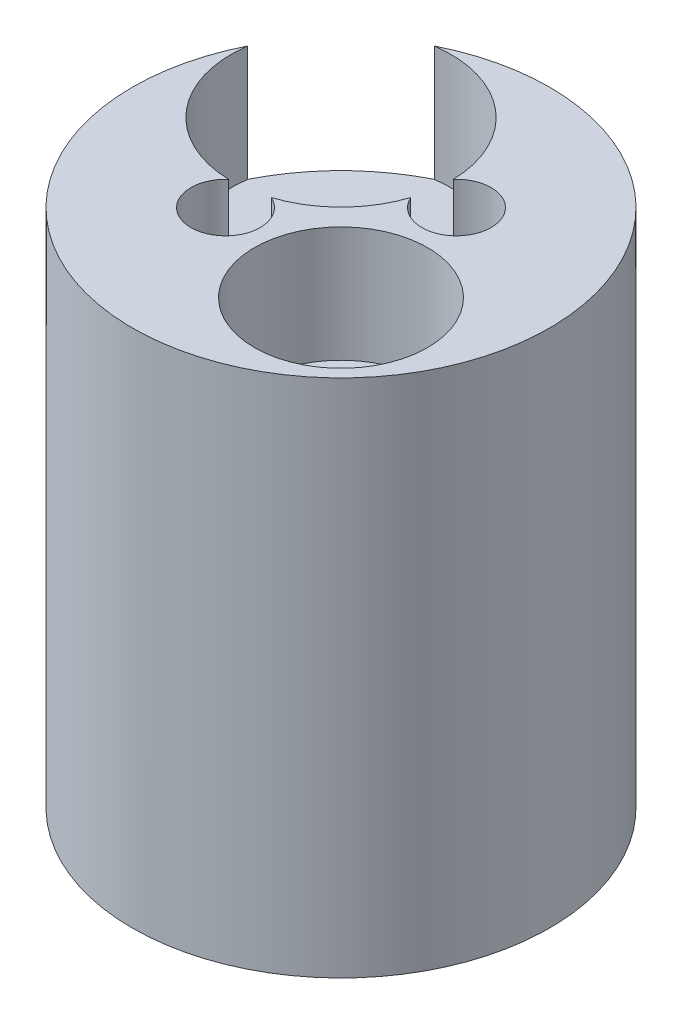
ISO-10303-21;
HEADER;
FILE_DESCRIPTION(('STEP AP214'),'2;1');
FILE_NAME('part.step','',(''),(''),'','','');
FILE_SCHEMA(('AUTOMOTIVE_DESIGN { 1 0 10303 214 1 1 1 1 }'));
ENDSEC;
DATA;
#1=APPLICATION_CONTEXT('core data for automotive mechanical design processes');
#2=APPLICATION_PROTOCOL_DEFINITION('international standard','automotive_design',2000,#1);
#3=PRODUCT_CONTEXT('',#1,'mechanical');
#4=PRODUCT('Part','Part','',(#3));
#5=PRODUCT_RELATED_PRODUCT_CATEGORY('part','',(#4));
#6=PRODUCT_DEFINITION_FORMATION('','',#4);
#7=PRODUCT_DEFINITION_CONTEXT('part definition',#1,'design');
#8=PRODUCT_DEFINITION('design','',#6,#7);
#9=PRODUCT_DEFINITION_SHAPE('','',#8);
#10=(LENGTH_UNIT() NAMED_UNIT(*) SI_UNIT(.MILLI.,.METRE.));
#11=(NAMED_UNIT(*) PLANE_ANGLE_UNIT() SI_UNIT($,.RADIAN.));
#12=(NAMED_UNIT(*) SI_UNIT($,.STERADIAN.) SOLID_ANGLE_UNIT());
#13=UNCERTAINTY_MEASURE_WITH_UNIT(LENGTH_MEASURE(1.E-05),#10,'distance_accuracy_value','');
#14=(GEOMETRIC_REPRESENTATION_CONTEXT(3) GLOBAL_UNCERTAINTY_ASSIGNED_CONTEXT((#13)) GLOBAL_UNIT_ASSIGNED_CONTEXT((#10,
#11,#12)) REPRESENTATION_CONTEXT('',''));
#15=CARTESIAN_POINT('',(0.,0.,0.));
#16=DIRECTION('',(0.,0.,1.));
#17=DIRECTION('',(1.,0.,0.));
#18=AXIS2_PLACEMENT_3D('',#15,#16,#17);
#19=CARTESIAN_POINT('',(-34.29,177.8,-34.29));
#20=DIRECTION('',(0.,1.,0.));
#21=DIRECTION('',(0.,0.,1.));
#22=AXIS2_PLACEMENT_3D('',#19,#20,#21);
#23=CYLINDRICAL_SURFACE('',#22,48.26);
#24=CARTESIAN_POINT('',(-34.29,177.8,-34.29));
#25=DIRECTION('',(0.,1.,0.));
#26=DIRECTION('',(0.,0.,1.));
#27=AXIS2_PLACEMENT_3D('',#24,#25,#26);
#28=CIRCLE('',#27,48.26);
#29=CARTESIAN_POINT('',(-19.1076610438493,177.8,11.5196516448286));
#30=VERTEX_POINT('',#29);
#31=CARTESIAN_POINT('',(11.5196516448286,177.8,-19.1076610438493));
#32=VERTEX_POINT('',#31);
#33=EDGE_CURVE('E57',#30,#32,#28,.T.);
#34=ORIENTED_EDGE('',*,*,#33,.F.);
#35=DIRECTION('',(0.,1.,0.));
#36=VECTOR('',#35,1.);
#37=CARTESIAN_POINT('',(-19.1076610438493,139.7,11.5196516448286));
#38=LINE('',#37,#36);
#39=CARTESIAN_POINT('',(-19.1076610438493,228.6,11.5196516448286));
#40=VERTEX_POINT('',#39);
#41=EDGE_CURVE('E11',#30,#40,#38,.T.);
#42=ORIENTED_EDGE('',*,*,#41,.T.);
#43=CARTESIAN_POINT('',(-34.29,228.6,-34.29));
#44=DIRECTION('',(0.,1.,0.));
#45=DIRECTION('',(0.,0.,1.));
#46=AXIS2_PLACEMENT_3D('',#43,#44,#45);
#47=CIRCLE('',#46,48.26);
#48=CARTESIAN_POINT('',(11.5196516448286,228.6,-19.1076610438493));
#49=VERTEX_POINT('',#48);
#50=EDGE_CURVE('E97',#40,#49,#47,.T.);
#51=ORIENTED_EDGE('',*,*,#50,.T.);
#52=DIRECTION('',(0.,1.,0.));
#53=VECTOR('',#52,1.);
#54=CARTESIAN_POINT('',(11.5196516448286,139.7,-19.1076610438493));
#55=LINE('',#54,#53);
#56=EDGE_CURVE('E114',#49,#32,#55,.F.);
#57=ORIENTED_EDGE('',*,*,#56,.T.);
#58=EDGE_LOOP('',(#34,#42,#51,#57));
#59=FACE_BOUND('',#58,.T.);
#60=ADVANCED_FACE('F35',(#59),#23,.F.);
#61=CARTESIAN_POINT('',(13.9557159371023,177.8,-35.4640927205439));
#62=VERTEX_POINT('',#61);
#63=CARTESIAN_POINT('',(-41.0187883238819,177.8,-82.0786075094513));
#64=VERTEX_POINT('',#63);
#65=EDGE_CURVE('E128',#62,#64,#28,.T.);
#66=ORIENTED_EDGE('',*,*,#65,.F.);
#67=DIRECTION('',(0.,1.,0.));
#68=VECTOR('',#67,1.);
#69=CARTESIAN_POINT('',(13.9557159371023,139.7,-35.4640927205439));
#70=LINE('',#69,#68);
#71=CARTESIAN_POINT('',(13.9557159371023,228.6,-35.4640927205439));
#72=VERTEX_POINT('',#71);
#73=EDGE_CURVE('E116',#62,#72,#70,.T.);
#74=ORIENTED_EDGE('',*,*,#73,.T.);
#75=CARTESIAN_POINT('',(-41.0187883238819,228.6,-82.0786075094514));
#76=VERTEX_POINT('',#75);
#77=EDGE_CURVE('E105',#72,#76,#47,.T.);
#78=ORIENTED_EDGE('',*,*,#77,.T.);
#79=DIRECTION('',(0.,1.,0.));
#80=VECTOR('',#79,1.);
#81=CARTESIAN_POINT('',(-41.0187883238819,203.2,-82.0786075094514));
#82=LINE('',#81,#80);
#83=EDGE_CURVE('E129',#64,#76,#82,.T.);
#84=ORIENTED_EDGE('',*,*,#83,.F.);
#85=EDGE_LOOP('',(#66,#74,#78,#84));
#86=FACE_BOUND('',#85,.T.);
#87=ADVANCED_FACE('F203',(#86),#23,.F.);
#88=CARTESIAN_POINT('',(0.,228.6,0.));
#89=DIRECTION('',(0.,-1.,0.));
#90=DIRECTION('',(0.,0.,-1.));
#91=AXIS2_PLACEMENT_3D('',#88,#89,#90);
#92=CYLINDRICAL_SURFACE('',#91,91.7575);
#93=CARTESIAN_POINT('',(0.,177.8,0.));
#94=DIRECTION('',(0.,1.,0.));
#95=DIRECTION('',(0.,0.,1.));
#96=AXIS2_PLACEMENT_3D('',#93,#94,#95);
#97=CIRCLE('',#96,91.7575);
#98=CARTESIAN_POINT('',(-82.0786075094513,177.8,-41.0187883238819));
#99=VERTEX_POINT('',#98);
#100=EDGE_CURVE('E107',#64,#99,#97,.T.);
#101=ORIENTED_EDGE('',*,*,#100,.F.);
#102=ORIENTED_EDGE('',*,*,#83,.T.);
#103=CARTESIAN_POINT('',(0.,228.6,0.));
#104=DIRECTION('',(0.,1.,0.));
#105=DIRECTION('',(0.,0.,1.));
#106=AXIS2_PLACEMENT_3D('',#103,#104,#105);
#107=CIRCLE('',#106,91.7575);
#108=CARTESIAN_POINT('',(-82.0786075094513,228.6,-41.0187883238819));
#109=VERTEX_POINT('',#108);
#110=EDGE_CURVE('E108',#109,#76,#107,.T.);
#111=ORIENTED_EDGE('',*,*,#110,.F.);
#112=DIRECTION('',(0.,1.,0.));
#113=VECTOR('',#112,1.);
#114=CARTESIAN_POINT('',(-82.0786075094513,203.2,-41.0187883238819));
#115=LINE('',#114,#113);
#116=EDGE_CURVE('E126',#109,#99,#115,.F.);
#117=ORIENTED_EDGE('',*,*,#116,.T.);
#118=EDGE_LOOP('',(#101,#102,#111,#117));
#119=FACE_BOUND('',#118,.T.);
#120=CARTESIAN_POINT('',(0.,0.,0.));
#121=DIRECTION('',(0.,1.,0.));
#122=DIRECTION('',(0.,0.,1.));
#123=AXIS2_PLACEMENT_3D('',#120,#121,#122);
#124=CIRCLE('',#123,91.7575);
#125=CARTESIAN_POINT('',(0.,0.,91.7575));
#126=VERTEX_POINT('',#125);
#127=EDGE_CURVE('E111',#126,#126,#124,.T.);
#128=ORIENTED_EDGE('',*,*,#127,.T.);
#129=EDGE_LOOP('',(#128));
#130=FACE_BOUND('',#129,.T.);
#131=ADVANCED_FACE('F37',(#119,#130),#92,.T.);
#132=CARTESIAN_POINT('',(0.,228.6,0.));
#133=DIRECTION('',(0.,1.,0.));
#134=DIRECTION('',(0.,0.,1.));
#135=AXIS2_PLACEMENT_3D('',#132,#133,#134);
#136=PLANE('',#135);
#137=CARTESIAN_POINT('',(-25.4,228.6,25.4));
#138=DIRECTION('',(0.,1.,0.));
#139=DIRECTION('',(0.,0.,1.));
#140=AXIS2_PLACEMENT_3D('',#137,#138,#139);
#141=CIRCLE('',#140,15.24);
#142=CARTESIAN_POINT('',(-35.4640927205439,228.6,13.9557159371023));
#143=VERTEX_POINT('',#142);
#144=EDGE_CURVE('E87',#143,#40,#141,.T.);
#145=ORIENTED_EDGE('',*,*,#144,.F.);
#146=EDGE_CURVE('E104',#109,#143,#47,.T.);
#147=ORIENTED_EDGE('',*,*,#146,.F.);
#148=ORIENTED_EDGE('',*,*,#110,.T.);
#149=ORIENTED_EDGE('',*,*,#77,.F.);
#150=CARTESIAN_POINT('',(25.4,228.6,-25.4));
#151=DIRECTION('',(0.,1.,0.));
#152=DIRECTION('',(0.,0.,1.));
#153=AXIS2_PLACEMENT_3D('',#150,#151,#152);
#154=CIRCLE('',#153,15.24);
#155=EDGE_CURVE('E103',#49,#72,#154,.T.);
#156=ORIENTED_EDGE('',*,*,#155,.F.);
#157=ORIENTED_EDGE('',*,*,#50,.F.);
#158=EDGE_LOOP('',(#145,#147,#148,#149,#156,#157));
#159=FACE_BOUND('',#158,.T.);
#160=CARTESIAN_POINT('',(34.29,228.6,34.29));
#161=DIRECTION('',(0.,1.,0.));
#162=DIRECTION('',(0.,0.,1.));
#163=AXIS2_PLACEMENT_3D('',#160,#161,#162);
#164=CIRCLE('',#163,38.1);
#165=CARTESIAN_POINT('',(34.29,228.6,72.39));
#166=VERTEX_POINT('',#165);
#167=EDGE_CURVE('E136',#166,#166,#164,.T.);
#168=ORIENTED_EDGE('',*,*,#167,.F.);
#169=EDGE_LOOP('',(#168));
#170=FACE_BOUND('',#169,.T.);
#171=ADVANCED_FACE('F100',(#159,#170),#136,.T.);
#172=CARTESIAN_POINT('',(0.,0.,0.));
#173=DIRECTION('',(0.,1.,0.));
#174=DIRECTION('',(0.,0.,1.));
#175=AXIS2_PLACEMENT_3D('',#172,#173,#174);
#176=PLANE('',#175);
#177=CARTESIAN_POINT('',(34.29,0.,-34.29));
#178=DIRECTION('',(0.,-1.,0.));
#179=DIRECTION('',(0.,0.,-1.));
#180=AXIS2_PLACEMENT_3D('',#177,#178,#179);
#181=CIRCLE('',#180,38.1);
#182=CARTESIAN_POINT('',(34.29,0.,-72.39));
#183=VERTEX_POINT('',#182);
#184=EDGE_CURVE('E170',#183,#183,#181,.T.);
#185=ORIENTED_EDGE('',*,*,#184,.F.);
#186=EDGE_LOOP('',(#185));
#187=FACE_BOUND('',#186,.T.);
#188=CARTESIAN_POINT('',(-34.29,0.,34.29));
#189=DIRECTION('',(0.,-1.,0.));
#190=DIRECTION('',(0.,0.,-1.));
#191=AXIS2_PLACEMENT_3D('',#188,#189,#190);
#192=CIRCLE('',#191,38.1);
#193=CARTESIAN_POINT('',(-34.29,0.,-3.81));
#194=VERTEX_POINT('',#193);
#195=EDGE_CURVE('E161',#194,#194,#192,.T.);
#196=ORIENTED_EDGE('',*,*,#195,.F.);
#197=EDGE_LOOP('',(#196));
#198=FACE_BOUND('',#197,.T.);
#199=CARTESIAN_POINT('',(25.4,0.,25.4));
#200=DIRECTION('',(0.,-1.,0.));
#201=DIRECTION('',(0.,0.,-1.));
#202=AXIS2_PLACEMENT_3D('',#199,#200,#201);
#203=CIRCLE('',#202,15.24);
#204=CARTESIAN_POINT('',(25.4,0.,10.16));
#205=VERTEX_POINT('',#204);
#206=EDGE_CURVE('E152',#205,#205,#203,.T.);
#207=ORIENTED_EDGE('',*,*,#206,.F.);
#208=EDGE_LOOP('',(#207));
#209=FACE_BOUND('',#208,.T.);
#210=CARTESIAN_POINT('',(-25.4,0.,-25.4));
#211=DIRECTION('',(0.,-1.,0.));
#212=DIRECTION('',(0.,0.,-1.));
#213=AXIS2_PLACEMENT_3D('',#210,#211,#212);
#214=CIRCLE('',#213,15.24);
#215=CARTESIAN_POINT('',(-25.4,0.,-40.64));
#216=VERTEX_POINT('',#215);
#217=EDGE_CURVE('E146',#216,#216,#214,.T.);
#218=ORIENTED_EDGE('',*,*,#217,.F.);
#219=EDGE_LOOP('',(#218));
#220=FACE_BOUND('',#219,.T.);
#221=ORIENTED_EDGE('',*,*,#127,.F.);
#222=EDGE_LOOP('',(#221));
#223=FACE_BOUND('',#222,.T.);
#224=ADVANCED_FACE('F185',(#187,#198,#209,#220,#223),#176,.F.);
#225=CARTESIAN_POINT('',(-34.29,177.8,-34.29));
#226=DIRECTION('',(0.,1.,0.));
#227=DIRECTION('',(0.,0.,1.));
#228=AXIS2_PLACEMENT_3D('',#225,#226,#227);
#229=PLANE('',#228);
#230=CARTESIAN_POINT('',(-25.4,177.8,-25.4));
#231=DIRECTION('',(0.,-1.,0.));
#232=DIRECTION('',(0.,0.,-1.));
#233=AXIS2_PLACEMENT_3D('',#230,#231,#232);
#234=CIRCLE('',#233,15.24);
#235=CARTESIAN_POINT('',(-25.4,177.8,-40.64));
#236=VERTEX_POINT('',#235);
#237=EDGE_CURVE('E93',#236,#236,#234,.T.);
#238=ORIENTED_EDGE('',*,*,#237,.T.);
#239=EDGE_LOOP('',(#238));
#240=FACE_BOUND('',#239,.T.);
#241=CARTESIAN_POINT('',(-25.4,177.8,25.4));
#242=DIRECTION('',(0.,1.,0.));
#243=DIRECTION('',(0.,0.,1.));
#244=AXIS2_PLACEMENT_3D('',#241,#242,#243);
#245=CIRCLE('',#244,15.24);
#246=CARTESIAN_POINT('',(-35.4640927205439,177.8,13.9557159371023));
#247=VERTEX_POINT('',#246);
#248=EDGE_CURVE('E50',#30,#247,#245,.T.);
#249=ORIENTED_EDGE('',*,*,#248,.F.);
#250=ORIENTED_EDGE('',*,*,#33,.T.);
#251=CARTESIAN_POINT('',(25.4,177.8,-25.4));
#252=DIRECTION('',(0.,1.,0.));
#253=DIRECTION('',(0.,0.,1.));
#254=AXIS2_PLACEMENT_3D('',#251,#252,#253);
#255=CIRCLE('',#254,15.24);
#256=EDGE_CURVE('E141',#62,#32,#255,.T.);
#257=ORIENTED_EDGE('',*,*,#256,.F.);
#258=ORIENTED_EDGE('',*,*,#65,.T.);
#259=ORIENTED_EDGE('',*,*,#100,.T.);
#260=EDGE_CURVE('E122',#99,#247,#28,.T.);
#261=ORIENTED_EDGE('',*,*,#260,.T.);
#262=EDGE_LOOP('',(#249,#250,#257,#258,#259,#261));
#263=FACE_BOUND('',#262,.T.);
#264=ADVANCED_FACE('F124',(#240,#263),#229,.T.);
#265=ORIENTED_EDGE('',*,*,#146,.T.);
#266=DIRECTION('',(0.,1.,0.));
#267=VECTOR('',#266,1.);
#268=CARTESIAN_POINT('',(-35.4640927205439,139.7,13.9557159371023));
#269=LINE('',#268,#267);
#270=EDGE_CURVE('E43',#143,#247,#269,.F.);
#271=ORIENTED_EDGE('',*,*,#270,.T.);
#272=ORIENTED_EDGE('',*,*,#260,.F.);
#273=ORIENTED_EDGE('',*,*,#116,.F.);
#274=EDGE_LOOP('',(#265,#271,#272,#273));
#275=FACE_BOUND('',#274,.T.);
#276=ADVANCED_FACE('F121',(#275),#23,.F.);
#277=CARTESIAN_POINT('',(34.29,177.8,34.29));
#278=DIRECTION('',(0.,1.,0.));
#279=DIRECTION('',(0.,0.,1.));
#280=AXIS2_PLACEMENT_3D('',#277,#278,#279);
#281=CYLINDRICAL_SURFACE('',#280,38.1);
#282=CARTESIAN_POINT('',(34.29,177.8,34.29));
#283=DIRECTION('',(0.,1.,0.));
#284=DIRECTION('',(0.,0.,1.));
#285=AXIS2_PLACEMENT_3D('',#282,#283,#284);
#286=CIRCLE('',#285,38.1);
#287=CARTESIAN_POINT('',(34.29,177.8,72.39));
#288=VERTEX_POINT('',#287);
#289=EDGE_CURVE('E132',#288,#288,#286,.T.);
#290=ORIENTED_EDGE('',*,*,#289,.F.);
#291=EDGE_LOOP('',(#290));
#292=FACE_BOUND('',#291,.T.);
#293=ORIENTED_EDGE('',*,*,#167,.T.);
#294=EDGE_LOOP('',(#293));
#295=FACE_BOUND('',#294,.T.);
#296=ADVANCED_FACE('F217',(#292,#295),#281,.F.);
#297=CARTESIAN_POINT('',(34.29,177.8,34.29));
#298=DIRECTION('',(0.,1.,0.));
#299=DIRECTION('',(0.,0.,1.));
#300=AXIS2_PLACEMENT_3D('',#297,#298,#299);
#301=PLANE('',#300);
#302=CARTESIAN_POINT('',(25.4,177.8,25.4));
#303=DIRECTION('',(0.,-1.,0.));
#304=DIRECTION('',(0.,0.,-1.));
#305=AXIS2_PLACEMENT_3D('',#302,#303,#304);
#306=CIRCLE('',#305,15.24);
#307=CARTESIAN_POINT('',(25.4,177.8,10.16));
#308=VERTEX_POINT('',#307);
#309=EDGE_CURVE('E149',#308,#308,#306,.T.);
#310=ORIENTED_EDGE('',*,*,#309,.T.);
#311=EDGE_LOOP('',(#310));
#312=FACE_BOUND('',#311,.T.);
#313=ORIENTED_EDGE('',*,*,#289,.T.);
#314=EDGE_LOOP('',(#313));
#315=FACE_BOUND('',#314,.T.);
#316=ADVANCED_FACE('F207',(#312,#315),#301,.T.);
#317=CARTESIAN_POINT('',(25.4,50.8,-25.4));
#318=DIRECTION('',(0.,1.,0.));
#319=DIRECTION('',(0.,0.,1.));
#320=AXIS2_PLACEMENT_3D('',#317,#318,#319);
#321=CYLINDRICAL_SURFACE('',#320,15.24);
#322=CARTESIAN_POINT('',(25.4,50.8,-25.4));
#323=DIRECTION('',(0.,-1.,0.));
#324=DIRECTION('',(0.,0.,-1.));
#325=AXIS2_PLACEMENT_3D('',#322,#323,#324);
#326=CIRCLE('',#325,15.24);
#327=CARTESIAN_POINT('',(25.4,50.8,-40.64));
#328=VERTEX_POINT('',#327);
#329=EDGE_CURVE('E164',#328,#328,#326,.F.);
#330=ORIENTED_EDGE('',*,*,#329,.F.);
#331=EDGE_LOOP('',(#330));
#332=FACE_BOUND('',#331,.T.);
#333=ORIENTED_EDGE('',*,*,#256,.T.);
#334=ORIENTED_EDGE('',*,*,#56,.F.);
#335=ORIENTED_EDGE('',*,*,#155,.T.);
#336=ORIENTED_EDGE('',*,*,#73,.F.);
#337=EDGE_LOOP('',(#333,#334,#335,#336));
#338=FACE_BOUND('',#337,.T.);
#339=ADVANCED_FACE('F205',(#332,#338),#321,.F.);
#340=CARTESIAN_POINT('',(-25.4,50.8,25.4));
#341=DIRECTION('',(0.,1.,0.));
#342=DIRECTION('',(0.,0.,1.));
#343=AXIS2_PLACEMENT_3D('',#340,#341,#342);
#344=CYLINDRICAL_SURFACE('',#343,15.24);
#345=CARTESIAN_POINT('',(-25.4,50.8,25.4));
#346=DIRECTION('',(0.,-1.,0.));
#347=DIRECTION('',(0.,0.,-1.));
#348=AXIS2_PLACEMENT_3D('',#345,#346,#347);
#349=CIRCLE('',#348,15.24);
#350=CARTESIAN_POINT('',(-25.4,50.8,10.16));
#351=VERTEX_POINT('',#350);
#352=EDGE_CURVE('E155',#351,#351,#349,.F.);
#353=ORIENTED_EDGE('',*,*,#352,.F.);
#354=EDGE_LOOP('',(#353));
#355=FACE_BOUND('',#354,.T.);
#356=ORIENTED_EDGE('',*,*,#248,.T.);
#357=ORIENTED_EDGE('',*,*,#270,.F.);
#358=ORIENTED_EDGE('',*,*,#144,.T.);
#359=ORIENTED_EDGE('',*,*,#41,.F.);
#360=EDGE_LOOP('',(#356,#357,#358,#359));
#361=FACE_BOUND('',#360,.T.);
#362=ADVANCED_FACE('F88',(#355,#361),#344,.F.);
#363=CARTESIAN_POINT('',(-25.4,177.8,-25.4));
#364=DIRECTION('',(0.,-1.,0.));
#365=DIRECTION('',(0.,0.,-1.));
#366=AXIS2_PLACEMENT_3D('',#363,#364,#365);
#367=CYLINDRICAL_SURFACE('',#366,15.24);
#368=ORIENTED_EDGE('',*,*,#237,.F.);
#369=EDGE_LOOP('',(#368));
#370=FACE_BOUND('',#369,.T.);
#371=ORIENTED_EDGE('',*,*,#217,.T.);
#372=EDGE_LOOP('',(#371));
#373=FACE_BOUND('',#372,.T.);
#374=ADVANCED_FACE('F214',(#370,#373),#367,.F.);
#375=CARTESIAN_POINT('',(25.4,177.8,25.4));
#376=DIRECTION('',(0.,-1.,0.));
#377=DIRECTION('',(0.,0.,-1.));
#378=AXIS2_PLACEMENT_3D('',#375,#376,#377);
#379=CYLINDRICAL_SURFACE('',#378,15.24);
#380=ORIENTED_EDGE('',*,*,#309,.F.);
#381=EDGE_LOOP('',(#380));
#382=FACE_BOUND('',#381,.T.);
#383=ORIENTED_EDGE('',*,*,#206,.T.);
#384=EDGE_LOOP('',(#383));
#385=FACE_BOUND('',#384,.T.);
#386=ADVANCED_FACE('F242',(#382,#385),#379,.F.);
#387=CARTESIAN_POINT('',(-34.29,50.8,34.29));
#388=DIRECTION('',(0.,-1.,0.));
#389=DIRECTION('',(0.,0.,-1.));
#390=AXIS2_PLACEMENT_3D('',#387,#388,#389);
#391=PLANE('',#390);
#392=CARTESIAN_POINT('',(-34.29,50.8,34.29));
#393=DIRECTION('',(0.,-1.,0.));
#394=DIRECTION('',(0.,0.,-1.));
#395=AXIS2_PLACEMENT_3D('',#392,#393,#394);
#396=CIRCLE('',#395,38.1);
#397=CARTESIAN_POINT('',(-34.29,50.8,-3.81));
#398=VERTEX_POINT('',#397);
#399=EDGE_CURVE('E160',#398,#398,#396,.T.);
#400=ORIENTED_EDGE('',*,*,#399,.T.);
#401=EDGE_LOOP('',(#400));
#402=FACE_BOUND('',#401,.T.);
#403=ORIENTED_EDGE('',*,*,#352,.T.);
#404=EDGE_LOOP('',(#403));
#405=FACE_BOUND('',#404,.T.);
#406=ADVANCED_FACE('F247',(#402,#405),#391,.T.);
#407=CARTESIAN_POINT('',(-34.29,50.8,34.29));
#408=DIRECTION('',(0.,-1.,0.));
#409=DIRECTION('',(0.,0.,-1.));
#410=AXIS2_PLACEMENT_3D('',#407,#408,#409);
#411=CYLINDRICAL_SURFACE('',#410,38.1);
#412=ORIENTED_EDGE('',*,*,#399,.F.);
#413=EDGE_LOOP('',(#412));
#414=FACE_BOUND('',#413,.T.);
#415=ORIENTED_EDGE('',*,*,#195,.T.);
#416=EDGE_LOOP('',(#415));
#417=FACE_BOUND('',#416,.T.);
#418=ADVANCED_FACE('F251',(#414,#417),#411,.F.);
#419=CARTESIAN_POINT('',(34.29,50.8,-34.29));
#420=DIRECTION('',(0.,-1.,0.));
#421=DIRECTION('',(0.,0.,-1.));
#422=AXIS2_PLACEMENT_3D('',#419,#420,#421);
#423=PLANE('',#422);
#424=CARTESIAN_POINT('',(34.29,50.8,-34.29));
#425=DIRECTION('',(0.,-1.,0.));
#426=DIRECTION('',(0.,0.,-1.));
#427=AXIS2_PLACEMENT_3D('',#424,#425,#426);
#428=CIRCLE('',#427,38.1);
#429=CARTESIAN_POINT('',(34.29,50.8,-72.39));
#430=VERTEX_POINT('',#429);
#431=EDGE_CURVE('E169',#430,#430,#428,.T.);
#432=ORIENTED_EDGE('',*,*,#431,.T.);
#433=EDGE_LOOP('',(#432));
#434=FACE_BOUND('',#433,.T.);
#435=ORIENTED_EDGE('',*,*,#329,.T.);
#436=EDGE_LOOP('',(#435));
#437=FACE_BOUND('',#436,.T.);
#438=ADVANCED_FACE('F176',(#434,#437),#423,.T.);
#439=CARTESIAN_POINT('',(34.29,50.8,-34.29));
#440=DIRECTION('',(0.,-1.,0.));
#441=DIRECTION('',(0.,0.,-1.));
#442=AXIS2_PLACEMENT_3D('',#439,#440,#441);
#443=CYLINDRICAL_SURFACE('',#442,38.1);
#444=ORIENTED_EDGE('',*,*,#431,.F.);
#445=EDGE_LOOP('',(#444));
#446=FACE_BOUND('',#445,.T.);
#447=ORIENTED_EDGE('',*,*,#184,.T.);
#448=EDGE_LOOP('',(#447));
#449=FACE_BOUND('',#448,.T.);
#450=ADVANCED_FACE('F179',(#446,#449),#443,.F.);
#451=CLOSED_SHELL('',(#60,#87,#131,#171,#224,#264,#276,#296,#316,#339,#362,#374,#386,#406,#418,
#438,#450));
#452=MANIFOLD_SOLID_BREP('B2',#451);
#453=ADVANCED_BREP_SHAPE_REPRESENTATION('',(#18,#452),#14);
#454=SHAPE_DEFINITION_REPRESENTATION(#9,#453);
ENDSEC;
END-ISO-10303-21;
